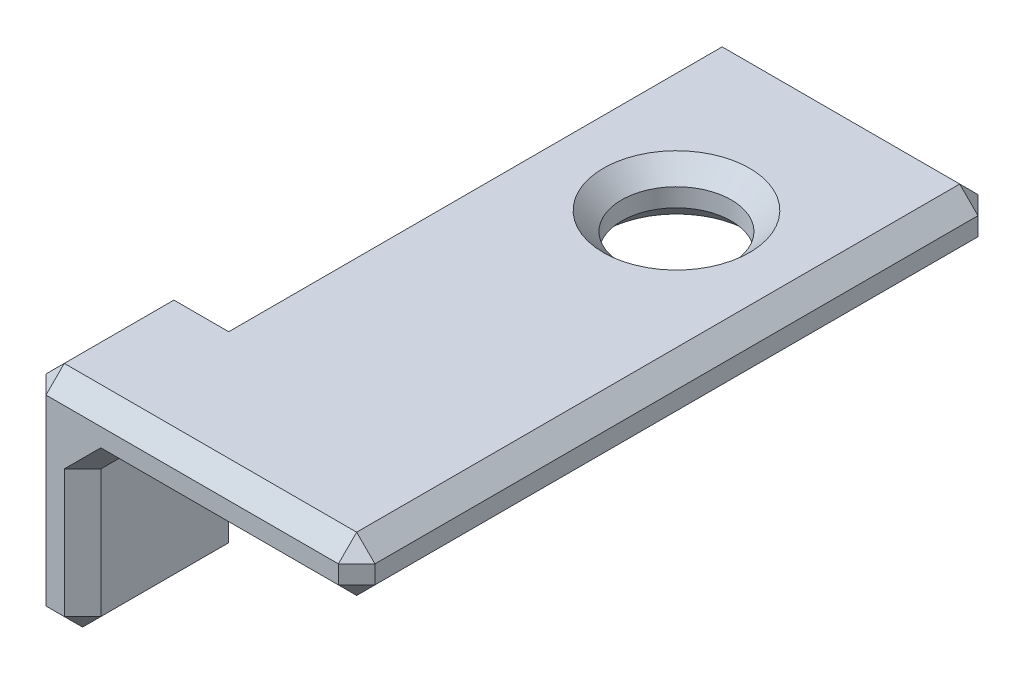
ISO-10303-21;
HEADER;
FILE_DESCRIPTION(('STEP AP214'),'2;1');
FILE_NAME('part.step','',(''),(''),'','','');
FILE_SCHEMA(('AUTOMOTIVE_DESIGN { 1 0 10303 214 1 1 1 1 }'));
ENDSEC;
DATA;
#1=APPLICATION_CONTEXT('core data for automotive mechanical design processes');
#2=APPLICATION_PROTOCOL_DEFINITION('international standard','automotive_design',2000,#1);
#3=PRODUCT_CONTEXT('',#1,'mechanical');
#4=PRODUCT('Part','Part','',(#3));
#5=PRODUCT_RELATED_PRODUCT_CATEGORY('part','',(#4));
#6=PRODUCT_DEFINITION_FORMATION('','',#4);
#7=PRODUCT_DEFINITION_CONTEXT('part definition',#1,'design');
#8=PRODUCT_DEFINITION('design','',#6,#7);
#9=PRODUCT_DEFINITION_SHAPE('','',#8);
#10=(LENGTH_UNIT() NAMED_UNIT(*) SI_UNIT(.MILLI.,.METRE.));
#11=(NAMED_UNIT(*) PLANE_ANGLE_UNIT() SI_UNIT($,.RADIAN.));
#12=(NAMED_UNIT(*) SI_UNIT($,.STERADIAN.) SOLID_ANGLE_UNIT());
#13=UNCERTAINTY_MEASURE_WITH_UNIT(LENGTH_MEASURE(1.E-05),#10,'distance_accuracy_value','');
#14=(GEOMETRIC_REPRESENTATION_CONTEXT(3) GLOBAL_UNCERTAINTY_ASSIGNED_CONTEXT((#13)) GLOBAL_UNIT_ASSIGNED_CONTEXT((#10,
#11,#12)) REPRESENTATION_CONTEXT('',''));
#15=CARTESIAN_POINT('',(0.,0.,0.));
#16=DIRECTION('',(0.,0.,1.));
#17=DIRECTION('',(1.,0.,0.));
#18=AXIS2_PLACEMENT_3D('',#15,#16,#17);
#19=CARTESIAN_POINT('',(0.,3.,0.));
#20=DIRECTION('',(1.,0.,0.));
#21=DIRECTION('',(0.,0.,-1.));
#22=AXIS2_PLACEMENT_3D('',#19,#20,#21);
#23=PLANE('',#22);
#24=DIRECTION('',(0.,0.,-1.));
#25=VECTOR('',#24,1.);
#26=CARTESIAN_POINT('',(0.,1.99999999999999,0.));
#27=LINE('',#26,#25);
#28=CARTESIAN_POINT('',(0.,2.,27.));
#29=VERTEX_POINT('',#28);
#30=CARTESIAN_POINT('',(0.,1.99999999999999,1.));
#31=VERTEX_POINT('',#30);
#32=EDGE_CURVE('E291',#29,#31,#27,.T.);
#33=ORIENTED_EDGE('',*,*,#32,.T.);
#34=DIRECTION('',(0.,-1.,0.));
#35=VECTOR('',#34,1.);
#36=CARTESIAN_POINT('',(0.,3.,1.));
#37=LINE('',#36,#35);
#38=CARTESIAN_POINT('',(0.,0.,1.));
#39=VERTEX_POINT('',#38);
#40=EDGE_CURVE('E213',#31,#39,#37,.T.);
#41=ORIENTED_EDGE('',*,*,#40,.T.);
#42=DIRECTION('',(0.,0.,1.));
#43=VECTOR('',#42,1.);
#44=CARTESIAN_POINT('',(0.,0.,0.));
#45=LINE('',#44,#43);
#46=CARTESIAN_POINT('',(0.,0.,27.));
#47=VERTEX_POINT('',#46);
#48=EDGE_CURVE('E199',#39,#47,#45,.T.);
#49=ORIENTED_EDGE('',*,*,#48,.T.);
#50=DIRECTION('',(0.,-1.,0.));
#51=VECTOR('',#50,1.);
#52=CARTESIAN_POINT('',(0.,3.,27.));
#53=LINE('',#52,#51);
#54=EDGE_CURVE('E189',#29,#47,#53,.T.);
#55=ORIENTED_EDGE('',*,*,#54,.F.);
#56=EDGE_LOOP('',(#33,#41,#49,#55));
#57=FACE_BOUND('',#56,.T.);
#58=ADVANCED_FACE('F43',(#57),#23,.F.);
#59=CARTESIAN_POINT('',(0.,3.,0.));
#60=DIRECTION('',(0.,1.,0.));
#61=DIRECTION('',(0.,0.,1.));
#62=AXIS2_PLACEMENT_3D('',#59,#60,#61);
#63=PLANE('',#62);
#64=CARTESIAN_POINT('',(7.5,3.,10.));
#65=DIRECTION('',(0.,1.,0.));
#66=DIRECTION('',(0.,0.,1.));
#67=AXIS2_PLACEMENT_3D('',#64,#65,#66);
#68=CIRCLE('',#67,4.);
#69=CARTESIAN_POINT('',(7.5,3.,14.));
#70=VERTEX_POINT('',#69);
#71=EDGE_CURVE('E236',#70,#70,#68,.F.);
#72=ORIENTED_EDGE('',*,*,#71,.T.);
#73=EDGE_LOOP('',(#72));
#74=FACE_BOUND('',#73,.T.);
#75=DIRECTION('',(0.,0.,-1.));
#76=VECTOR('',#75,1.);
#77=CARTESIAN_POINT('',(14.,3.,0.));
#78=LINE('',#77,#76);
#79=CARTESIAN_POINT('',(14.,3.,34.));
#80=VERTEX_POINT('',#79);
#81=CARTESIAN_POINT('',(14.,3.,1.));
#82=VERTEX_POINT('',#81);
#83=EDGE_CURVE('E231',#80,#82,#78,.T.);
#84=ORIENTED_EDGE('',*,*,#83,.T.);
#85=DIRECTION('',(-1.,0.,0.));
#86=VECTOR('',#85,1.);
#87=CARTESIAN_POINT('',(0.,3.,1.));
#88=LINE('',#87,#86);
#89=CARTESIAN_POINT('',(1.,3.,1.));
#90=VERTEX_POINT('',#89);
#91=EDGE_CURVE('E233',#82,#90,#88,.T.);
#92=ORIENTED_EDGE('',*,*,#91,.T.);
#93=DIRECTION('',(0.,0.,1.));
#94=VECTOR('',#93,1.);
#95=CARTESIAN_POINT('',(1.,3.,27.));
#96=LINE('',#95,#94);
#97=CARTESIAN_POINT('',(1.,3.,28.));
#98=VERTEX_POINT('',#97);
#99=EDGE_CURVE('E225',#90,#98,#96,.T.);
#100=ORIENTED_EDGE('',*,*,#99,.T.);
#101=DIRECTION('',(-1.,0.,0.));
#102=VECTOR('',#101,1.);
#103=CARTESIAN_POINT('',(0.,3.,28.));
#104=LINE('',#103,#102);
#105=CARTESIAN_POINT('',(-1.99999999999999,3.,28.));
#106=VERTEX_POINT('',#105);
#107=EDGE_CURVE('E223',#98,#106,#104,.T.);
#108=ORIENTED_EDGE('',*,*,#107,.T.);
#109=DIRECTION('',(0.,0.,1.));
#110=VECTOR('',#109,1.);
#111=CARTESIAN_POINT('',(-1.99999999999999,3.,0.));
#112=LINE('',#111,#110);
#113=CARTESIAN_POINT('',(-1.99999999999999,3.,34.));
#114=VERTEX_POINT('',#113);
#115=EDGE_CURVE('E227',#106,#114,#112,.T.);
#116=ORIENTED_EDGE('',*,*,#115,.T.);
#117=DIRECTION('',(1.,0.,0.));
#118=VECTOR('',#117,1.);
#119=CARTESIAN_POINT('',(0.,3.,34.));
#120=LINE('',#119,#118);
#121=EDGE_CURVE('E229',#114,#80,#120,.T.);
#122=ORIENTED_EDGE('',*,*,#121,.T.);
#123=EDGE_LOOP('',(#84,#92,#100,#108,#116,#122));
#124=FACE_BOUND('',#123,.T.);
#125=ADVANCED_FACE('F458',(#74,#124),#63,.T.);
#126=CARTESIAN_POINT('',(0.,0.,0.));
#127=DIRECTION('',(0.,1.,0.));
#128=DIRECTION('',(0.,0.,1.));
#129=AXIS2_PLACEMENT_3D('',#126,#127,#128);
#130=PLANE('',#129);
#131=CARTESIAN_POINT('',(7.5,0.,10.));
#132=DIRECTION('',(0.,1.,0.));
#133=DIRECTION('',(0.,0.,1.));
#134=AXIS2_PLACEMENT_3D('',#131,#132,#133);
#135=CIRCLE('',#134,4.);
#136=CARTESIAN_POINT('',(7.5,0.,14.));
#137=VERTEX_POINT('',#136);
#138=EDGE_CURVE('E210',#137,#137,#135,.T.);
#139=ORIENTED_EDGE('',*,*,#138,.T.);
#140=EDGE_LOOP('',(#139));
#141=FACE_BOUND('',#140,.T.);
#142=DIRECTION('',(0.,0.,-1.));
#143=VECTOR('',#142,1.);
#144=CARTESIAN_POINT('',(1.,0.,0.));
#145=LINE('',#144,#143);
#146=CARTESIAN_POINT('',(1.00000000000001,0.,34.));
#147=VERTEX_POINT('',#146);
#148=CARTESIAN_POINT('',(1.00000000000001,0.,27.));
#149=VERTEX_POINT('',#148);
#150=EDGE_CURVE('E208',#147,#149,#145,.T.);
#151=ORIENTED_EDGE('',*,*,#150,.T.);
#152=DIRECTION('',(-1.,0.,0.));
#153=VECTOR('',#152,1.);
#154=CARTESIAN_POINT('',(0.,0.,27.));
#155=LINE('',#154,#153);
#156=EDGE_CURVE('E192',#149,#47,#155,.T.);
#157=ORIENTED_EDGE('',*,*,#156,.T.);
#158=ORIENTED_EDGE('',*,*,#48,.F.);
#159=DIRECTION('',(1.,0.,0.));
#160=VECTOR('',#159,1.);
#161=CARTESIAN_POINT('',(0.,0.,1.00000000000001));
#162=LINE('',#161,#160);
#163=CARTESIAN_POINT('',(14.,0.,1.00000000000001));
#164=VERTEX_POINT('',#163);
#165=EDGE_CURVE('E239',#39,#164,#162,.T.);
#166=ORIENTED_EDGE('',*,*,#165,.T.);
#167=DIRECTION('',(0.,0.,1.));
#168=VECTOR('',#167,1.);
#169=CARTESIAN_POINT('',(14.,0.,0.));
#170=LINE('',#169,#168);
#171=CARTESIAN_POINT('',(14.,0.,34.));
#172=VERTEX_POINT('',#171);
#173=EDGE_CURVE('E241',#164,#172,#170,.T.);
#174=ORIENTED_EDGE('',*,*,#173,.T.);
#175=DIRECTION('',(-1.,0.,0.));
#176=VECTOR('',#175,1.);
#177=CARTESIAN_POINT('',(0.,0.,34.));
#178=LINE('',#177,#176);
#179=EDGE_CURVE('E243',#172,#147,#178,.T.);
#180=ORIENTED_EDGE('',*,*,#179,.T.);
#181=EDGE_LOOP('',(#151,#157,#158,#166,#174,#180));
#182=FACE_BOUND('',#181,.T.);
#183=ADVANCED_FACE('F204',(#141,#182),#130,.F.);
#184=CARTESIAN_POINT('',(15.,3.,0.));
#185=DIRECTION('',(-1.,0.,0.));
#186=DIRECTION('',(0.,0.,1.));
#187=AXIS2_PLACEMENT_3D('',#184,#185,#186);
#188=PLANE('',#187);
#189=DIRECTION('',(0.,0.,1.));
#190=VECTOR('',#189,1.);
#191=CARTESIAN_POINT('',(15.,1.99999999999999,35.));
#192=LINE('',#191,#190);
#193=CARTESIAN_POINT('',(15.,1.99999999999999,1.00000000000001));
#194=VERTEX_POINT('',#193);
#195=CARTESIAN_POINT('',(15.,1.99999999999999,34.));
#196=VERTEX_POINT('',#195);
#197=EDGE_CURVE('E273',#194,#196,#192,.T.);
#198=ORIENTED_EDGE('',*,*,#197,.T.);
#199=DIRECTION('',(0.,-1.,0.));
#200=VECTOR('',#199,1.);
#201=CARTESIAN_POINT('',(15.,0.,34.));
#202=LINE('',#201,#200);
#203=CARTESIAN_POINT('',(15.,1.,34.));
#204=VERTEX_POINT('',#203);
#205=EDGE_CURVE('E279',#196,#204,#202,.T.);
#206=ORIENTED_EDGE('',*,*,#205,.T.);
#207=DIRECTION('',(0.,0.,-1.));
#208=VECTOR('',#207,1.);
#209=CARTESIAN_POINT('',(15.,1.,0.));
#210=LINE('',#209,#208);
#211=CARTESIAN_POINT('',(15.,1.,1.00000000000001));
#212=VERTEX_POINT('',#211);
#213=EDGE_CURVE('E277',#204,#212,#210,.T.);
#214=ORIENTED_EDGE('',*,*,#213,.T.);
#215=DIRECTION('',(0.,1.,0.));
#216=VECTOR('',#215,1.);
#217=CARTESIAN_POINT('',(15.,3.,1.00000000000001));
#218=LINE('',#217,#216);
#219=EDGE_CURVE('E275',#212,#194,#218,.T.);
#220=ORIENTED_EDGE('',*,*,#219,.T.);
#221=EDGE_LOOP('',(#198,#206,#214,#220));
#222=FACE_BOUND('',#221,.T.);
#223=ADVANCED_FACE('F467',(#222),#188,.F.);
#224=CARTESIAN_POINT('',(0.,3.,0.));
#225=DIRECTION('',(0.,0.,1.));
#226=DIRECTION('',(1.,0.,0.));
#227=AXIS2_PLACEMENT_3D('',#224,#225,#226);
#228=PLANE('',#227);
#229=DIRECTION('',(1.,0.,0.));
#230=VECTOR('',#229,1.);
#231=CARTESIAN_POINT('',(15.,1.99999999999999,0.));
#232=LINE('',#231,#230);
#233=CARTESIAN_POINT('',(1.00000000000001,1.99999999999999,0.));
#234=VERTEX_POINT('',#233);
#235=CARTESIAN_POINT('',(14.,1.99999999999999,0.));
#236=VERTEX_POINT('',#235);
#237=EDGE_CURVE('E282',#234,#236,#232,.T.);
#238=ORIENTED_EDGE('',*,*,#237,.T.);
#239=DIRECTION('',(0.,-1.,0.));
#240=VECTOR('',#239,1.);
#241=CARTESIAN_POINT('',(14.,3.,0.));
#242=LINE('',#241,#240);
#243=CARTESIAN_POINT('',(14.,1.,0.));
#244=VERTEX_POINT('',#243);
#245=EDGE_CURVE('E288',#236,#244,#242,.T.);
#246=ORIENTED_EDGE('',*,*,#245,.T.);
#247=DIRECTION('',(-1.,0.,0.));
#248=VECTOR('',#247,1.);
#249=CARTESIAN_POINT('',(0.,1.,0.));
#250=LINE('',#249,#248);
#251=CARTESIAN_POINT('',(1.00000000000001,1.,0.));
#252=VERTEX_POINT('',#251);
#253=EDGE_CURVE('E286',#244,#252,#250,.T.);
#254=ORIENTED_EDGE('',*,*,#253,.T.);
#255=DIRECTION('',(0.,1.,0.));
#256=VECTOR('',#255,1.);
#257=CARTESIAN_POINT('',(1.00000000000001,3.,0.));
#258=LINE('',#257,#256);
#259=EDGE_CURVE('E284',#252,#234,#258,.T.);
#260=ORIENTED_EDGE('',*,*,#259,.T.);
#261=EDGE_LOOP('',(#238,#246,#254,#260));
#262=FACE_BOUND('',#261,.T.);
#263=ADVANCED_FACE('F889',(#262),#228,.F.);
#264=CARTESIAN_POINT('',(7.5,3.,10.));
#265=DIRECTION('',(0.,-1.,0.));
#266=DIRECTION('',(0.,0.,-1.));
#267=AXIS2_PLACEMENT_3D('',#264,#265,#266);
#268=CYLINDRICAL_SURFACE('',#267,3.);
#269=CARTESIAN_POINT('',(7.5,2.,10.));
#270=DIRECTION('',(0.,1.,0.));
#271=DIRECTION('',(0.,0.,1.));
#272=AXIS2_PLACEMENT_3D('',#269,#270,#271);
#273=CIRCLE('',#272,3.);
#274=CARTESIAN_POINT('',(7.5,2.,13.));
#275=VERTEX_POINT('',#274);
#276=EDGE_CURVE('E217',#275,#275,#273,.T.);
#277=ORIENTED_EDGE('',*,*,#276,.T.);
#278=EDGE_LOOP('',(#277));
#279=FACE_BOUND('',#278,.T.);
#280=CARTESIAN_POINT('',(7.5,1.,10.));
#281=DIRECTION('',(0.,1.,0.));
#282=DIRECTION('',(0.,0.,1.));
#283=AXIS2_PLACEMENT_3D('',#280,#281,#282);
#284=CIRCLE('',#283,3.);
#285=CARTESIAN_POINT('',(7.5,1.,13.));
#286=VERTEX_POINT('',#285);
#287=EDGE_CURVE('E214',#286,#286,#284,.F.);
#288=ORIENTED_EDGE('',*,*,#287,.T.);
#289=EDGE_LOOP('',(#288));
#290=FACE_BOUND('',#289,.T.);
#291=ADVANCED_FACE('F879',(#279,#290),#268,.F.);
#292=CARTESIAN_POINT('',(0.,0.,35.));
#293=DIRECTION('',(0.,0.,1.));
#294=DIRECTION('',(1.,0.,0.));
#295=AXIS2_PLACEMENT_3D('',#292,#293,#294);
#296=PLANE('',#295);
#297=DIRECTION('',(-0.707106781186546,-0.707106781186549,0.));
#298=VECTOR('',#297,1.);
#299=CARTESIAN_POINT('',(0.,0.,35.));
#300=LINE('',#299,#298);
#301=CARTESIAN_POINT('',(1.00000000000001,1.,35.));
#302=VERTEX_POINT('',#301);
#303=CARTESIAN_POINT('',(0.,0.,35.));
#304=VERTEX_POINT('',#303);
#305=EDGE_CURVE('E261',#302,#304,#300,.T.);
#306=ORIENTED_EDGE('',*,*,#305,.F.);
#307=DIRECTION('',(1.,0.,0.));
#308=VECTOR('',#307,1.);
#309=CARTESIAN_POINT('',(15.,1.,35.));
#310=LINE('',#309,#308);
#311=CARTESIAN_POINT('',(14.,1.,35.));
#312=VERTEX_POINT('',#311);
#313=EDGE_CURVE('E264',#302,#312,#310,.T.);
#314=ORIENTED_EDGE('',*,*,#313,.T.);
#315=DIRECTION('',(0.,1.,0.));
#316=VECTOR('',#315,1.);
#317=CARTESIAN_POINT('',(14.,3.,35.));
#318=LINE('',#317,#316);
#319=CARTESIAN_POINT('',(14.,1.99999999999999,35.));
#320=VERTEX_POINT('',#319);
#321=EDGE_CURVE('E256',#312,#320,#318,.T.);
#322=ORIENTED_EDGE('',*,*,#321,.T.);
#323=DIRECTION('',(-1.,0.,0.));
#324=VECTOR('',#323,1.);
#325=CARTESIAN_POINT('',(0.,1.99999999999999,35.));
#326=LINE('',#325,#324);
#327=CARTESIAN_POINT('',(-2.,1.99999999999999,35.));
#328=VERTEX_POINT('',#327);
#329=EDGE_CURVE('E254',#320,#328,#326,.T.);
#330=ORIENTED_EDGE('',*,*,#329,.T.);
#331=DIRECTION('',(0.,-1.,0.));
#332=VECTOR('',#331,1.);
#333=CARTESIAN_POINT('',(-2.,0.,35.));
#334=LINE('',#333,#332);
#335=CARTESIAN_POINT('',(-2.,-7.99999999999999,35.));
#336=VERTEX_POINT('',#335);
#337=EDGE_CURVE('E250',#328,#336,#334,.T.);
#338=ORIENTED_EDGE('',*,*,#337,.T.);
#339=DIRECTION('',(1.,0.,0.));
#340=VECTOR('',#339,1.);
#341=CARTESIAN_POINT('',(0.,-7.99999999999999,35.));
#342=LINE('',#341,#340);
#343=CARTESIAN_POINT('',(-1.,-7.99999999999999,35.));
#344=VERTEX_POINT('',#343);
#345=EDGE_CURVE('E248',#336,#344,#342,.T.);
#346=ORIENTED_EDGE('',*,*,#345,.T.);
#347=DIRECTION('',(0.,1.,0.));
#348=VECTOR('',#347,1.);
#349=CARTESIAN_POINT('',(-1.,0.,35.));
#350=LINE('',#349,#348);
#351=CARTESIAN_POINT('',(-1.,-1.00000000000001,35.));
#352=VERTEX_POINT('',#351);
#353=EDGE_CURVE('E252',#344,#352,#350,.T.);
#354=ORIENTED_EDGE('',*,*,#353,.T.);
#355=DIRECTION('',(-0.707106781186546,-0.707106781186549,0.));
#356=VECTOR('',#355,1.);
#357=CARTESIAN_POINT('',(0.,0.,35.));
#358=LINE('',#357,#356);
#359=EDGE_CURVE('E258',#304,#352,#358,.T.);
#360=ORIENTED_EDGE('',*,*,#359,.F.);
#361=EDGE_LOOP('',(#306,#314,#322,#330,#338,#346,#354,#360));
#362=FACE_BOUND('',#361,.T.);
#363=ADVANCED_FACE('F863',(#362),#296,.T.);
#364=CARTESIAN_POINT('',(0.,3.,35.));
#365=DIRECTION('',(1.,0.,0.));
#366=DIRECTION('',(0.,0.,-1.));
#367=AXIS2_PLACEMENT_3D('',#364,#365,#366);
#368=PLANE('',#367);
#369=CARTESIAN_POINT('',(0.,-1.00000000000001,27.));
#370=VERTEX_POINT('',#369);
#371=CARTESIAN_POINT('',(0.,-7.99999999999999,27.));
#372=VERTEX_POINT('',#371);
#373=EDGE_CURVE('E200',#370,#372,#53,.T.);
#374=ORIENTED_EDGE('',*,*,#373,.F.);
#375=DIRECTION('',(0.,0.,1.));
#376=VECTOR('',#375,1.);
#377=CARTESIAN_POINT('',(0.,-1.00000000000001,35.));
#378=LINE('',#377,#376);
#379=CARTESIAN_POINT('',(0.,-1.00000000000001,34.));
#380=VERTEX_POINT('',#379);
#381=EDGE_CURVE('E271',#370,#380,#378,.T.);
#382=ORIENTED_EDGE('',*,*,#381,.T.);
#383=DIRECTION('',(0.,-1.,0.));
#384=VECTOR('',#383,1.);
#385=CARTESIAN_POINT('',(0.,3.,34.));
#386=LINE('',#385,#384);
#387=CARTESIAN_POINT('',(0.,-7.99999999999999,34.));
#388=VERTEX_POINT('',#387);
#389=EDGE_CURVE('E269',#380,#388,#386,.T.);
#390=ORIENTED_EDGE('',*,*,#389,.T.);
#391=DIRECTION('',(0.,0.,-1.));
#392=VECTOR('',#391,1.);
#393=CARTESIAN_POINT('',(0.,-7.99999999999999,27.));
#394=LINE('',#393,#392);
#395=EDGE_CURVE('E267',#388,#372,#394,.T.);
#396=ORIENTED_EDGE('',*,*,#395,.T.);
#397=EDGE_LOOP('',(#374,#382,#390,#396));
#398=FACE_BOUND('',#397,.T.);
#399=ADVANCED_FACE('F856',(#398),#368,.T.);
#400=CARTESIAN_POINT('',(0.,3.,27.));
#401=DIRECTION('',(0.,0.,-1.));
#402=DIRECTION('',(-1.,0.,0.));
#403=AXIS2_PLACEMENT_3D('',#400,#401,#402);
#404=PLANE('',#403);
#405=DIRECTION('',(0.,1.,0.));
#406=VECTOR('',#405,1.);
#407=CARTESIAN_POINT('',(-1.99999999999999,3.,27.));
#408=LINE('',#407,#406);
#409=CARTESIAN_POINT('',(-1.99999999999999,-9.,27.));
#410=VERTEX_POINT('',#409);
#411=CARTESIAN_POINT('',(-1.99999999999999,2.,27.));
#412=VERTEX_POINT('',#411);
#413=EDGE_CURVE('E305',#410,#412,#408,.T.);
#414=ORIENTED_EDGE('',*,*,#413,.T.);
#415=DIRECTION('',(1.,0.,0.));
#416=VECTOR('',#415,1.);
#417=CARTESIAN_POINT('',(0.,2.,27.));
#418=LINE('',#417,#416);
#419=EDGE_CURVE('E195',#412,#29,#418,.T.);
#420=ORIENTED_EDGE('',*,*,#419,.T.);
#421=ORIENTED_EDGE('',*,*,#54,.T.);
#422=ORIENTED_EDGE('',*,*,#156,.F.);
#423=DIRECTION('',(-0.707106781186546,-0.707106781186549,0.));
#424=VECTOR('',#423,1.);
#425=CARTESIAN_POINT('',(0.,-1.00000000000001,27.));
#426=LINE('',#425,#424);
#427=EDGE_CURVE('E11',#149,#370,#426,.T.);
#428=ORIENTED_EDGE('',*,*,#427,.T.);
#429=ORIENTED_EDGE('',*,*,#373,.T.);
#430=DIRECTION('',(-0.707106781186546,-0.707106781186549,0.));
#431=VECTOR('',#430,1.);
#432=CARTESIAN_POINT('',(5.5,-2.49999999999998,27.));
#433=LINE('',#432,#431);
#434=CARTESIAN_POINT('',(-1.,-9.,27.));
#435=VERTEX_POINT('',#434);
#436=EDGE_CURVE('E303',#372,#435,#433,.T.);
#437=ORIENTED_EDGE('',*,*,#436,.T.);
#438=DIRECTION('',(1.,0.,0.));
#439=VECTOR('',#438,1.);
#440=CARTESIAN_POINT('',(0.,-9.,27.));
#441=LINE('',#440,#439);
#442=EDGE_CURVE('E403',#410,#435,#441,.T.);
#443=ORIENTED_EDGE('',*,*,#442,.F.);
#444=EDGE_LOOP('',(#414,#420,#421,#422,#428,#429,#437,#443));
#445=FACE_BOUND('',#444,.T.);
#446=ADVANCED_FACE('F191',(#445),#404,.T.);
#447=CARTESIAN_POINT('',(-3.,3.,35.));
#448=DIRECTION('',(-1.,0.,0.));
#449=DIRECTION('',(0.,0.,1.));
#450=AXIS2_PLACEMENT_3D('',#447,#448,#449);
#451=PLANE('',#450);
#452=DIRECTION('',(0.,0.,1.));
#453=VECTOR('',#452,1.);
#454=CARTESIAN_POINT('',(-3.,-7.99999999999999,35.));
#455=LINE('',#454,#453);
#456=CARTESIAN_POINT('',(-3.,-7.99999999999999,28.));
#457=VERTEX_POINT('',#456);
#458=CARTESIAN_POINT('',(-3.,-7.99999999999999,34.));
#459=VERTEX_POINT('',#458);
#460=EDGE_CURVE('E294',#457,#459,#455,.T.);
#461=ORIENTED_EDGE('',*,*,#460,.T.);
#462=DIRECTION('',(0.,1.,0.));
#463=VECTOR('',#462,1.);
#464=CARTESIAN_POINT('',(-3.,3.,34.));
#465=LINE('',#464,#463);
#466=CARTESIAN_POINT('',(-3.,2.,34.));
#467=VERTEX_POINT('',#466);
#468=EDGE_CURVE('E300',#459,#467,#465,.T.);
#469=ORIENTED_EDGE('',*,*,#468,.T.);
#470=DIRECTION('',(0.,0.,-1.));
#471=VECTOR('',#470,1.);
#472=CARTESIAN_POINT('',(-3.,2.,35.));
#473=LINE('',#472,#471);
#474=CARTESIAN_POINT('',(-3.,2.,28.));
#475=VERTEX_POINT('',#474);
#476=EDGE_CURVE('E298',#467,#475,#473,.T.);
#477=ORIENTED_EDGE('',*,*,#476,.T.);
#478=DIRECTION('',(0.,-1.,0.));
#479=VECTOR('',#478,1.);
#480=CARTESIAN_POINT('',(-3.,3.,28.));
#481=LINE('',#480,#479);
#482=EDGE_CURVE('E296',#475,#457,#481,.T.);
#483=ORIENTED_EDGE('',*,*,#482,.T.);
#484=EDGE_LOOP('',(#461,#469,#477,#483));
#485=FACE_BOUND('',#484,.T.);
#486=ADVANCED_FACE('F438',(#485),#451,.T.);
#487=CARTESIAN_POINT('',(0.,-9.,0.));
#488=DIRECTION('',(0.,1.,0.));
#489=DIRECTION('',(0.,0.,1.));
#490=AXIS2_PLACEMENT_3D('',#487,#488,#489);
#491=PLANE('',#490);
#492=DIRECTION('',(-1.,0.,0.));
#493=VECTOR('',#492,1.);
#494=CARTESIAN_POINT('',(-3.,-9.,34.));
#495=LINE('',#494,#493);
#496=CARTESIAN_POINT('',(-1.,-9.,34.));
#497=VERTEX_POINT('',#496);
#498=CARTESIAN_POINT('',(-2.,-9.,34.));
#499=VERTEX_POINT('',#498);
#500=EDGE_CURVE('E61',#497,#499,#495,.T.);
#501=ORIENTED_EDGE('',*,*,#500,.T.);
#502=DIRECTION('',(0.,0.,-1.));
#503=VECTOR('',#502,1.);
#504=CARTESIAN_POINT('',(-1.99999999999999,-9.,27.));
#505=LINE('',#504,#503);
#506=EDGE_CURVE('E53',#499,#410,#505,.T.);
#507=ORIENTED_EDGE('',*,*,#506,.T.);
#508=ORIENTED_EDGE('',*,*,#442,.T.);
#509=DIRECTION('',(0.,0.,1.));
#510=VECTOR('',#509,1.);
#511=CARTESIAN_POINT('',(-1.,-9.,35.));
#512=LINE('',#511,#510);
#513=EDGE_CURVE('E66',#435,#497,#512,.T.);
#514=ORIENTED_EDGE('',*,*,#513,.T.);
#515=EDGE_LOOP('',(#501,#507,#508,#514));
#516=FACE_BOUND('',#515,.T.);
#517=ADVANCED_FACE('F432',(#516),#491,.F.);
#518=CARTESIAN_POINT('',(7.5,2.,10.));
#519=DIRECTION('',(0.,1.,0.));
#520=DIRECTION('',(0.,0.,1.));
#521=AXIS2_PLACEMENT_3D('',#518,#519,#520);
#522=CONICAL_SURFACE('',#521,3.,0.785398163397448);
#523=ORIENTED_EDGE('',*,*,#71,.F.);
#524=EDGE_LOOP('',(#523));
#525=FACE_BOUND('',#524,.T.);
#526=ORIENTED_EDGE('',*,*,#276,.F.);
#527=EDGE_LOOP('',(#526));
#528=FACE_BOUND('',#527,.T.);
#529=ADVANCED_FACE('F470',(#525,#528),#522,.F.);
#530=CARTESIAN_POINT('',(7.5,0.,10.));
#531=DIRECTION('',(0.,-1.,0.));
#532=DIRECTION('',(0.,0.,-1.));
#533=AXIS2_PLACEMENT_3D('',#530,#531,#532);
#534=CONICAL_SURFACE('',#533,4.,0.785398163397447);
#535=ORIENTED_EDGE('',*,*,#287,.F.);
#536=EDGE_LOOP('',(#535));
#537=FACE_BOUND('',#536,.T.);
#538=ORIENTED_EDGE('',*,*,#138,.F.);
#539=EDGE_LOOP('',(#538));
#540=FACE_BOUND('',#539,.T.);
#541=ADVANCED_FACE('F476',(#537,#540),#534,.F.);
#542=CARTESIAN_POINT('',(0.,2.,27.));
#543=DIRECTION('',(0.,-0.707106781186549,0.707106781186546));
#544=DIRECTION('',(1.,0.,0.));
#545=AXIS2_PLACEMENT_3D('',#542,#543,#544);
#546=PLANE('',#545);
#547=DIRECTION('',(0.577350269189624,0.577350269189626,0.577350269189628));
#548=VECTOR('',#547,1.);
#549=CARTESIAN_POINT('',(-8.33333333333333,-6.33333333333337,18.6666666666666));
#550=LINE('',#549,#548);
#551=EDGE_CURVE('E395',#29,#98,#550,.T.);
#552=ORIENTED_EDGE('',*,*,#551,.F.);
#553=ORIENTED_EDGE('',*,*,#419,.F.);
#554=DIRECTION('',(0.,0.707106781186546,0.707106781186549));
#555=VECTOR('',#554,1.);
#556=CARTESIAN_POINT('',(-1.99999999999999,2.5,27.5));
#557=LINE('',#556,#555);
#558=EDGE_CURVE('E397',#106,#412,#557,.F.);
#559=ORIENTED_EDGE('',*,*,#558,.F.);
#560=ORIENTED_EDGE('',*,*,#107,.F.);
#561=EDGE_LOOP('',(#552,#553,#559,#560));
#562=FACE_BOUND('',#561,.T.);
#563=ADVANCED_FACE('F46',(#562),#546,.F.);
#564=CARTESIAN_POINT('',(-3.,3.,28.));
#565=DIRECTION('',(0.707106781186546,0.,0.707106781186549));
#566=DIRECTION('',(0.,-1.,0.));
#567=AXIS2_PLACEMENT_3D('',#564,#565,#566);
#568=PLANE('',#567);
#569=DIRECTION('',(0.707106781186549,0.,-0.707106781186546));
#570=VECTOR('',#569,1.);
#571=CARTESIAN_POINT('',(-3.,2.,28.));
#572=LINE('',#571,#570);
#573=EDGE_CURVE('E48',#412,#475,#572,.F.);
#574=ORIENTED_EDGE('',*,*,#573,.F.);
#575=ORIENTED_EDGE('',*,*,#413,.F.);
#576=DIRECTION('',(-0.577350269189626,0.577350269189628,0.577350269189624));
#577=VECTOR('',#576,1.);
#578=CARTESIAN_POINT('',(6.99999999999998,-18.,18.0000000000001));
#579=LINE('',#578,#577);
#580=EDGE_CURVE('E392',#457,#410,#579,.F.);
#581=ORIENTED_EDGE('',*,*,#580,.F.);
#582=ORIENTED_EDGE('',*,*,#482,.F.);
#583=EDGE_LOOP('',(#574,#575,#581,#582));
#584=FACE_BOUND('',#583,.T.);
#585=ADVANCED_FACE('F435',(#584),#568,.F.);
#586=CARTESIAN_POINT('',(-3.,2.,28.));
#587=DIRECTION('',(-0.577350269189624,0.577350269189628,-0.577350269189626));
#588=DIRECTION('',(0.,0.707106781186546,0.707106781186549));
#589=AXIS2_PLACEMENT_3D('',#586,#587,#588);
#590=PLANE('',#589);
#591=ORIENTED_EDGE('',*,*,#558,.T.);
#592=ORIENTED_EDGE('',*,*,#573,.T.);
#593=DIRECTION('',(-0.707106781186549,-0.707106781186546,0.));
#594=VECTOR('',#593,1.);
#595=CARTESIAN_POINT('',(-3.,2.,28.));
#596=LINE('',#595,#594);
#597=EDGE_CURVE('E389',#106,#475,#596,.T.);
#598=ORIENTED_EDGE('',*,*,#597,.F.);
#599=EDGE_LOOP('',(#591,#592,#598));
#600=FACE_BOUND('',#599,.T.);
#601=ADVANCED_FACE('F446',(#600),#590,.T.);
#602=CARTESIAN_POINT('',(1.,3.,0.));
#603=DIRECTION('',(-0.707106781186549,0.707106781186546,0.));
#604=DIRECTION('',(0.,0.,-1.));
#605=AXIS2_PLACEMENT_3D('',#602,#603,#604);
#606=PLANE('',#605);
#607=ORIENTED_EDGE('',*,*,#551,.T.);
#608=ORIENTED_EDGE('',*,*,#99,.F.);
#609=DIRECTION('',(0.707106781186546,0.707106781186549,0.));
#610=VECTOR('',#609,1.);
#611=CARTESIAN_POINT('',(0.500000000000002,2.5,1.));
#612=LINE('',#611,#610);
#613=EDGE_CURVE('E384',#31,#90,#612,.T.);
#614=ORIENTED_EDGE('',*,*,#613,.F.);
#615=ORIENTED_EDGE('',*,*,#32,.F.);
#616=EDGE_LOOP('',(#607,#608,#614,#615));
#617=FACE_BOUND('',#616,.T.);
#618=ADVANCED_FACE('F448',(#617),#606,.T.);
#619=CARTESIAN_POINT('',(-1.99999999999999,-9.,0.));
#620=DIRECTION('',(-0.707106781186549,-0.707106781186546,0.));
#621=DIRECTION('',(0.,0.,1.));
#622=AXIS2_PLACEMENT_3D('',#619,#620,#621);
#623=PLANE('',#622);
#624=ORIENTED_EDGE('',*,*,#580,.T.);
#625=ORIENTED_EDGE('',*,*,#506,.F.);
#626=DIRECTION('',(0.707106781186546,-0.707106781186549,0.));
#627=VECTOR('',#626,1.);
#628=CARTESIAN_POINT('',(-2.5,-8.5,34.));
#629=LINE('',#628,#627);
#630=EDGE_CURVE('E381',#459,#499,#629,.T.);
#631=ORIENTED_EDGE('',*,*,#630,.F.);
#632=ORIENTED_EDGE('',*,*,#460,.F.);
#633=EDGE_LOOP('',(#624,#625,#631,#632));
#634=FACE_BOUND('',#633,.T.);
#635=ADVANCED_FACE('F430',(#634),#623,.T.);
#636=CARTESIAN_POINT('',(-2.,0.,35.));
#637=DIRECTION('',(0.707106781186549,0.,-0.707106781186546));
#638=DIRECTION('',(0.,-1.,0.));
#639=AXIS2_PLACEMENT_3D('',#636,#637,#638);
#640=PLANE('',#639);
#641=DIRECTION('',(-0.707106781186546,0.,-0.707106781186549));
#642=VECTOR('',#641,1.);
#643=CARTESIAN_POINT('',(-3.,2.,34.));
#644=LINE('',#643,#642);
#645=EDGE_CURVE('E375',#467,#328,#644,.F.);
#646=ORIENTED_EDGE('',*,*,#645,.F.);
#647=ORIENTED_EDGE('',*,*,#468,.F.);
#648=DIRECTION('',(0.707106781186546,0.,0.707106781186549));
#649=VECTOR('',#648,1.);
#650=CARTESIAN_POINT('',(-2.,-7.99999999999999,35.));
#651=LINE('',#650,#649);
#652=EDGE_CURVE('E378',#336,#459,#651,.F.);
#653=ORIENTED_EDGE('',*,*,#652,.F.);
#654=ORIENTED_EDGE('',*,*,#337,.F.);
#655=EDGE_LOOP('',(#646,#647,#653,#654));
#656=FACE_BOUND('',#655,.T.);
#657=ADVANCED_FACE('F635',(#656),#640,.F.);
#658=CARTESIAN_POINT('',(-3.,2.,35.));
#659=DIRECTION('',(0.707106781186546,-0.707106781186549,0.));
#660=DIRECTION('',(0.,0.,-1.));
#661=AXIS2_PLACEMENT_3D('',#658,#659,#660);
#662=PLANE('',#661);
#663=ORIENTED_EDGE('',*,*,#597,.T.);
#664=ORIENTED_EDGE('',*,*,#476,.F.);
#665=DIRECTION('',(0.707106781186549,0.707106781186546,0.));
#666=VECTOR('',#665,1.);
#667=CARTESIAN_POINT('',(-3.,2.,34.));
#668=LINE('',#667,#666);
#669=EDGE_CURVE('E373',#114,#467,#668,.F.);
#670=ORIENTED_EDGE('',*,*,#669,.F.);
#671=ORIENTED_EDGE('',*,*,#115,.F.);
#672=EDGE_LOOP('',(#663,#664,#670,#671));
#673=FACE_BOUND('',#672,.T.);
#674=ADVANCED_FACE('F443',(#673),#662,.F.);
#675=CARTESIAN_POINT('',(0.,3.,1.));
#676=DIRECTION('',(0.,0.707106781186546,-0.707106781186549));
#677=DIRECTION('',(1.,0.,0.));
#678=AXIS2_PLACEMENT_3D('',#675,#676,#677);
#679=PLANE('',#678);
#680=DIRECTION('',(0.,-0.707106781186549,-0.707106781186546));
#681=VECTOR('',#680,1.);
#682=CARTESIAN_POINT('',(1.00000000000001,1.99999999999999,0.));
#683=LINE('',#682,#681);
#684=EDGE_CURVE('E386',#90,#234,#683,.T.);
#685=ORIENTED_EDGE('',*,*,#684,.F.);
#686=ORIENTED_EDGE('',*,*,#91,.F.);
#687=DIRECTION('',(0.,0.707106781186549,0.707106781186546));
#688=VECTOR('',#687,1.);
#689=CARTESIAN_POINT('',(14.,2.5,0.500000000000002));
#690=LINE('',#689,#688);
#691=EDGE_CURVE('E370',#236,#82,#690,.T.);
#692=ORIENTED_EDGE('',*,*,#691,.F.);
#693=ORIENTED_EDGE('',*,*,#237,.F.);
#694=EDGE_LOOP('',(#685,#686,#692,#693));
#695=FACE_BOUND('',#694,.T.);
#696=ADVANCED_FACE('F622',(#695),#679,.T.);
#697=CARTESIAN_POINT('',(1.00000000000001,1.99999999999999,0.));
#698=DIRECTION('',(-0.577350269189626,0.577350269189624,-0.577350269189628));
#699=DIRECTION('',(-0.707106781186549,0.,0.707106781186546));
#700=AXIS2_PLACEMENT_3D('',#697,#698,#699);
#701=PLANE('',#700);
#702=ORIENTED_EDGE('',*,*,#613,.T.);
#703=ORIENTED_EDGE('',*,*,#684,.T.);
#704=DIRECTION('',(0.707106781186549,0.,-0.707106781186546));
#705=VECTOR('',#704,1.);
#706=CARTESIAN_POINT('',(1.00000000000001,1.99999999999999,0.));
#707=LINE('',#706,#705);
#708=EDGE_CURVE('E367',#31,#234,#707,.T.);
#709=ORIENTED_EDGE('',*,*,#708,.F.);
#710=EDGE_LOOP('',(#702,#703,#709));
#711=FACE_BOUND('',#710,.T.);
#712=ADVANCED_FACE('F616',(#711),#701,.T.);
#713=CARTESIAN_POINT('',(-2.,-7.99999999999999,35.));
#714=DIRECTION('',(-0.577350269189628,-0.577350269189622,0.577350269189627));
#715=DIRECTION('',(0.707106781186546,0.,0.707106781186549));
#716=AXIS2_PLACEMENT_3D('',#713,#714,#715);
#717=PLANE('',#716);
#718=ORIENTED_EDGE('',*,*,#652,.T.);
#719=ORIENTED_EDGE('',*,*,#630,.T.);
#720=DIRECTION('',(0.,0.70710678118655,0.707106781186545));
#721=VECTOR('',#720,1.);
#722=CARTESIAN_POINT('',(-2.,-7.99999999999999,35.));
#723=LINE('',#722,#721);
#724=EDGE_CURVE('E364',#336,#499,#723,.F.);
#725=ORIENTED_EDGE('',*,*,#724,.F.);
#726=EDGE_LOOP('',(#718,#719,#725));
#727=FACE_BOUND('',#726,.T.);
#728=ADVANCED_FACE('F425',(#727),#717,.T.);
#729=CARTESIAN_POINT('',(-3.,2.,34.));
#730=DIRECTION('',(-0.577350269189627,0.577350269189624,0.577350269189626));
#731=DIRECTION('',(0.707106781186547,0.,0.707106781186548));
#732=AXIS2_PLACEMENT_3D('',#729,#730,#731);
#733=PLANE('',#732);
#734=ORIENTED_EDGE('',*,*,#669,.T.);
#735=ORIENTED_EDGE('',*,*,#645,.T.);
#736=DIRECTION('',(0.,-0.70710678118655,0.707106781186545));
#737=VECTOR('',#736,1.);
#738=CARTESIAN_POINT('',(-1.99999999999999,2.5,34.5));
#739=LINE('',#738,#737);
#740=EDGE_CURVE('E361',#114,#328,#739,.T.);
#741=ORIENTED_EDGE('',*,*,#740,.F.);
#742=EDGE_LOOP('',(#734,#735,#741));
#743=FACE_BOUND('',#742,.T.);
#744=ADVANCED_FACE('F603',(#743),#733,.T.);
#745=CARTESIAN_POINT('',(15.,1.99999999999999,1.00000000000001));
#746=DIRECTION('',(0.577350269189628,0.577350269189624,-0.577350269189626));
#747=DIRECTION('',(-0.707106781186546,0.,-0.707106781186549));
#748=AXIS2_PLACEMENT_3D('',#745,#746,#747);
#749=PLANE('',#748);
#750=DIRECTION('',(0.707106781186546,0.,0.707106781186549));
#751=VECTOR('',#750,1.);
#752=CARTESIAN_POINT('',(15.,1.99999999999999,1.00000000000001));
#753=LINE('',#752,#751);
#754=EDGE_CURVE('E355',#236,#194,#753,.T.);
#755=ORIENTED_EDGE('',*,*,#754,.F.);
#756=ORIENTED_EDGE('',*,*,#691,.T.);
#757=DIRECTION('',(0.707106781186546,-0.707106781186549,0.));
#758=VECTOR('',#757,1.);
#759=CARTESIAN_POINT('',(15.,1.99999999999999,1.00000000000001));
#760=LINE('',#759,#758);
#761=EDGE_CURVE('E358',#194,#82,#760,.F.);
#762=ORIENTED_EDGE('',*,*,#761,.F.);
#763=EDGE_LOOP('',(#755,#756,#762));
#764=FACE_BOUND('',#763,.T.);
#765=ADVANCED_FACE('F596',(#764),#749,.T.);
#766=CARTESIAN_POINT('',(0.,3.,1.));
#767=DIRECTION('',(0.707106781186546,0.,0.707106781186549));
#768=DIRECTION('',(0.,-1.,0.));
#769=AXIS2_PLACEMENT_3D('',#766,#767,#768);
#770=PLANE('',#769);
#771=ORIENTED_EDGE('',*,*,#708,.T.);
#772=ORIENTED_EDGE('',*,*,#259,.F.);
#773=DIRECTION('',(-0.577350269189628,-0.577350269189624,0.577350269189626));
#774=VECTOR('',#773,1.);
#775=CARTESIAN_POINT('',(0.999999999999999,0.999999999999995,0.));
#776=LINE('',#775,#774);
#777=EDGE_CURVE('E352',#39,#252,#776,.F.);
#778=ORIENTED_EDGE('',*,*,#777,.F.);
#779=ORIENTED_EDGE('',*,*,#40,.F.);
#780=EDGE_LOOP('',(#771,#772,#778,#779));
#781=FACE_BOUND('',#780,.T.);
#782=ADVANCED_FACE('F590',(#781),#770,.F.);
#783=CARTESIAN_POINT('',(-1.00000000000001,-9.,0.));
#784=DIRECTION('',(0.707106781186549,-0.707106781186546,0.));
#785=DIRECTION('',(0.,0.,-1.));
#786=AXIS2_PLACEMENT_3D('',#783,#784,#785);
#787=PLANE('',#786);
#788=ORIENTED_EDGE('',*,*,#436,.F.);
#789=ORIENTED_EDGE('',*,*,#395,.F.);
#790=DIRECTION('',(0.707106781186546,0.707106781186549,0.));
#791=VECTOR('',#790,1.);
#792=CARTESIAN_POINT('',(0.,-7.99999999999999,34.));
#793=LINE('',#792,#791);
#794=EDGE_CURVE('E349',#497,#388,#793,.T.);
#795=ORIENTED_EDGE('',*,*,#794,.F.);
#796=ORIENTED_EDGE('',*,*,#513,.F.);
#797=EDGE_LOOP('',(#788,#789,#795,#796));
#798=FACE_BOUND('',#797,.T.);
#799=ADVANCED_FACE('F413',(#798),#787,.T.);
#800=CARTESIAN_POINT('',(0.,-9.,34.));
#801=DIRECTION('',(0.,-0.707106781186545,0.70710678118655));
#802=DIRECTION('',(1.,0.,0.));
#803=AXIS2_PLACEMENT_3D('',#800,#801,#802);
#804=PLANE('',#803);
#805=ORIENTED_EDGE('',*,*,#724,.T.);
#806=ORIENTED_EDGE('',*,*,#500,.F.);
#807=DIRECTION('',(0.,-0.70710678118655,-0.707106781186545));
#808=VECTOR('',#807,1.);
#809=CARTESIAN_POINT('',(-1.,-8.5,34.5));
#810=LINE('',#809,#808);
#811=EDGE_CURVE('E346',#344,#497,#810,.T.);
#812=ORIENTED_EDGE('',*,*,#811,.F.);
#813=ORIENTED_EDGE('',*,*,#345,.F.);
#814=EDGE_LOOP('',(#805,#806,#812,#813));
#815=FACE_BOUND('',#814,.T.);
#816=ADVANCED_FACE('F422',(#815),#804,.T.);
#817=CARTESIAN_POINT('',(0.,3.,34.));
#818=DIRECTION('',(0.,-0.707106781186545,-0.70710678118655));
#819=DIRECTION('',(1.,0.,0.));
#820=AXIS2_PLACEMENT_3D('',#817,#818,#819);
#821=PLANE('',#820);
#822=ORIENTED_EDGE('',*,*,#740,.T.);
#823=ORIENTED_EDGE('',*,*,#329,.F.);
#824=DIRECTION('',(0.,0.70710678118655,-0.707106781186545));
#825=VECTOR('',#824,1.);
#826=CARTESIAN_POINT('',(14.,1.99999999999999,35.));
#827=LINE('',#826,#825);
#828=EDGE_CURVE('E343',#80,#320,#827,.F.);
#829=ORIENTED_EDGE('',*,*,#828,.F.);
#830=ORIENTED_EDGE('',*,*,#121,.F.);
#831=EDGE_LOOP('',(#822,#823,#829,#830));
#832=FACE_BOUND('',#831,.T.);
#833=ADVANCED_FACE('F572',(#832),#821,.F.);
#834=CARTESIAN_POINT('',(14.,3.,0.));
#835=DIRECTION('',(0.707106781186549,0.707106781186546,0.));
#836=DIRECTION('',(0.,0.,1.));
#837=AXIS2_PLACEMENT_3D('',#834,#835,#836);
#838=PLANE('',#837);
#839=ORIENTED_EDGE('',*,*,#761,.T.);
#840=ORIENTED_EDGE('',*,*,#83,.F.);
#841=DIRECTION('',(-0.707106781186546,0.707106781186549,0.));
#842=VECTOR('',#841,1.);
#843=CARTESIAN_POINT('',(14.5,2.5,34.));
#844=LINE('',#843,#842);
#845=EDGE_CURVE('E340',#196,#80,#844,.T.);
#846=ORIENTED_EDGE('',*,*,#845,.F.);
#847=ORIENTED_EDGE('',*,*,#197,.F.);
#848=EDGE_LOOP('',(#839,#840,#846,#847));
#849=FACE_BOUND('',#848,.T.);
#850=ADVANCED_FACE('F565',(#849),#838,.T.);
#851=CARTESIAN_POINT('',(14.,3.,0.));
#852=DIRECTION('',(-0.707106781186549,0.,0.707106781186547));
#853=DIRECTION('',(0.,-1.,0.));
#854=AXIS2_PLACEMENT_3D('',#851,#852,#853);
#855=PLANE('',#854);
#856=ORIENTED_EDGE('',*,*,#754,.T.);
#857=ORIENTED_EDGE('',*,*,#219,.F.);
#858=DIRECTION('',(-0.707106781186546,0.,-0.707106781186548));
#859=VECTOR('',#858,1.);
#860=CARTESIAN_POINT('',(15.,1.,1.00000000000001));
#861=LINE('',#860,#859);
#862=EDGE_CURVE('E337',#244,#212,#861,.F.);
#863=ORIENTED_EDGE('',*,*,#862,.F.);
#864=ORIENTED_EDGE('',*,*,#245,.F.);
#865=EDGE_LOOP('',(#856,#857,#863,#864));
#866=FACE_BOUND('',#865,.T.);
#867=ADVANCED_FACE('F558',(#866),#855,.F.);
#868=CARTESIAN_POINT('',(0.,1.,0.));
#869=DIRECTION('',(0.,0.707106781186549,0.707106781186546));
#870=DIRECTION('',(-1.,0.,0.));
#871=AXIS2_PLACEMENT_3D('',#868,#869,#870);
#872=PLANE('',#871);
#873=ORIENTED_EDGE('',*,*,#777,.T.);
#874=ORIENTED_EDGE('',*,*,#253,.F.);
#875=DIRECTION('',(0.,-0.707106781186546,0.707106781186549));
#876=VECTOR('',#875,1.);
#877=CARTESIAN_POINT('',(14.,0.500000000000002,0.500000000000004));
#878=LINE('',#877,#876);
#879=EDGE_CURVE('E335',#164,#244,#878,.F.);
#880=ORIENTED_EDGE('',*,*,#879,.F.);
#881=ORIENTED_EDGE('',*,*,#165,.F.);
#882=EDGE_LOOP('',(#873,#874,#880,#881));
#883=FACE_BOUND('',#882,.T.);
#884=ADVANCED_FACE('F552',(#883),#872,.F.);
#885=CARTESIAN_POINT('',(0.,-7.99999999999999,34.));
#886=DIRECTION('',(0.577350269189628,-0.577350269189622,0.577350269189627));
#887=DIRECTION('',(0.707106781186546,0.,-0.707106781186549));
#888=AXIS2_PLACEMENT_3D('',#885,#886,#887);
#889=PLANE('',#888);
#890=ORIENTED_EDGE('',*,*,#811,.T.);
#891=ORIENTED_EDGE('',*,*,#794,.T.);
#892=DIRECTION('',(0.707106781186546,0.,-0.707106781186549));
#893=VECTOR('',#892,1.);
#894=CARTESIAN_POINT('',(0.,-7.99999999999999,34.));
#895=LINE('',#894,#893);
#896=EDGE_CURVE('E332',#344,#388,#895,.T.);
#897=ORIENTED_EDGE('',*,*,#896,.F.);
#898=EDGE_LOOP('',(#890,#891,#897));
#899=FACE_BOUND('',#898,.T.);
#900=ADVANCED_FACE('F418',(#899),#889,.T.);
#901=CARTESIAN_POINT('',(14.,1.99999999999999,35.));
#902=DIRECTION('',(0.577350269189628,0.577350269189622,0.577350269189627));
#903=DIRECTION('',(0.707106781186546,0.,-0.707106781186549));
#904=AXIS2_PLACEMENT_3D('',#901,#902,#903);
#905=PLANE('',#904);
#906=ORIENTED_EDGE('',*,*,#845,.T.);
#907=ORIENTED_EDGE('',*,*,#828,.T.);
#908=DIRECTION('',(0.707106781186546,0.,-0.707106781186549));
#909=VECTOR('',#908,1.);
#910=CARTESIAN_POINT('',(14.,1.99999999999999,35.));
#911=LINE('',#910,#909);
#912=EDGE_CURVE('E329',#196,#320,#911,.F.);
#913=ORIENTED_EDGE('',*,*,#912,.F.);
#914=EDGE_LOOP('',(#906,#907,#913));
#915=FACE_BOUND('',#914,.T.);
#916=ADVANCED_FACE('F539',(#915),#905,.T.);
#917=CARTESIAN_POINT('',(15.,1.,1.00000000000001));
#918=DIRECTION('',(0.577350269189626,-0.577350269189628,-0.577350269189624));
#919=DIRECTION('',(0.707106781186549,0.707106781186546,0.));
#920=AXIS2_PLACEMENT_3D('',#917,#918,#919);
#921=PLANE('',#920);
#922=ORIENTED_EDGE('',*,*,#879,.T.);
#923=ORIENTED_EDGE('',*,*,#862,.T.);
#924=DIRECTION('',(0.707106781186549,0.707106781186546,0.));
#925=VECTOR('',#924,1.);
#926=CARTESIAN_POINT('',(15.,1.,1.00000000000001));
#927=LINE('',#926,#925);
#928=EDGE_CURVE('E326',#164,#212,#927,.T.);
#929=ORIENTED_EDGE('',*,*,#928,.F.);
#930=EDGE_LOOP('',(#922,#923,#929));
#931=FACE_BOUND('',#930,.T.);
#932=ADVANCED_FACE('F532',(#931),#921,.T.);
#933=CARTESIAN_POINT('',(0.,-1.00000000000001,35.));
#934=DIRECTION('',(-0.707106781186549,0.707106781186546,0.));
#935=DIRECTION('',(0.,0.,1.));
#936=AXIS2_PLACEMENT_3D('',#933,#934,#935);
#937=PLANE('',#936);
#938=ORIENTED_EDGE('',*,*,#427,.F.);
#939=ORIENTED_EDGE('',*,*,#150,.F.);
#940=DIRECTION('',(0.707106781186546,0.707106781186549,0.));
#941=VECTOR('',#940,1.);
#942=CARTESIAN_POINT('',(0.,-1.00000000000001,34.));
#943=LINE('',#942,#941);
#944=EDGE_CURVE('E323',#380,#147,#943,.T.);
#945=ORIENTED_EDGE('',*,*,#944,.F.);
#946=ORIENTED_EDGE('',*,*,#381,.F.);
#947=EDGE_LOOP('',(#938,#939,#945,#946));
#948=FACE_BOUND('',#947,.T.);
#949=ADVANCED_FACE('F525',(#948),#937,.F.);
#950=CARTESIAN_POINT('',(0.,3.,34.));
#951=DIRECTION('',(-0.707106781186549,0.,-0.707106781186546));
#952=DIRECTION('',(0.,-1.,0.));
#953=AXIS2_PLACEMENT_3D('',#950,#951,#952);
#954=PLANE('',#953);
#955=ORIENTED_EDGE('',*,*,#896,.T.);
#956=ORIENTED_EDGE('',*,*,#389,.F.);
#957=DIRECTION('',(0.707106781186546,0.,-0.707106781186549));
#958=VECTOR('',#957,1.);
#959=CARTESIAN_POINT('',(-1.,-1.00000000000001,35.));
#960=LINE('',#959,#958);
#961=EDGE_CURVE('E320',#352,#380,#960,.T.);
#962=ORIENTED_EDGE('',*,*,#961,.F.);
#963=ORIENTED_EDGE('',*,*,#353,.F.);
#964=EDGE_LOOP('',(#955,#956,#962,#963));
#965=FACE_BOUND('',#964,.T.);
#966=ADVANCED_FACE('F518',(#965),#954,.F.);
#967=CARTESIAN_POINT('',(14.,0.,35.));
#968=DIRECTION('',(0.707106781186549,0.,0.707106781186546));
#969=DIRECTION('',(0.,-1.,0.));
#970=AXIS2_PLACEMENT_3D('',#967,#968,#969);
#971=PLANE('',#970);
#972=ORIENTED_EDGE('',*,*,#912,.T.);
#973=ORIENTED_EDGE('',*,*,#321,.F.);
#974=DIRECTION('',(-0.707106781186546,0.,0.707106781186549));
#975=VECTOR('',#974,1.);
#976=CARTESIAN_POINT('',(14.,1.,35.));
#977=LINE('',#976,#975);
#978=EDGE_CURVE('E317',#204,#312,#977,.T.);
#979=ORIENTED_EDGE('',*,*,#978,.F.);
#980=ORIENTED_EDGE('',*,*,#205,.F.);
#981=EDGE_LOOP('',(#972,#973,#979,#980));
#982=FACE_BOUND('',#981,.T.);
#983=ADVANCED_FACE('F511',(#982),#971,.T.);
#984=CARTESIAN_POINT('',(15.,1.,0.));
#985=DIRECTION('',(-0.707106781186546,0.707106781186549,0.));
#986=DIRECTION('',(0.,0.,-1.));
#987=AXIS2_PLACEMENT_3D('',#984,#985,#986);
#988=PLANE('',#987);
#989=ORIENTED_EDGE('',*,*,#928,.T.);
#990=ORIENTED_EDGE('',*,*,#213,.F.);
#991=DIRECTION('',(-0.707106781186549,-0.707106781186546,0.));
#992=VECTOR('',#991,1.);
#993=CARTESIAN_POINT('',(14.5,0.500000000000002,34.));
#994=LINE('',#993,#992);
#995=EDGE_CURVE('E315',#172,#204,#994,.F.);
#996=ORIENTED_EDGE('',*,*,#995,.F.);
#997=ORIENTED_EDGE('',*,*,#173,.F.);
#998=EDGE_LOOP('',(#989,#990,#996,#997));
#999=FACE_BOUND('',#998,.T.);
#1000=ADVANCED_FACE('F504',(#999),#988,.F.);
#1001=CARTESIAN_POINT('',(0.,-1.00000000000001,34.));
#1002=DIRECTION('',(0.577350269189627,-0.577350269189625,0.577350269189625));
#1003=DIRECTION('',(0.707106781186546,0.,-0.707106781186549));
#1004=AXIS2_PLACEMENT_3D('',#1001,#1002,#1003);
#1005=PLANE('',#1004);
#1006=ORIENTED_EDGE('',*,*,#961,.T.);
#1007=ORIENTED_EDGE('',*,*,#944,.T.);
#1008=DIRECTION('',(0.,0.707106781186546,0.707106781186549));
#1009=VECTOR('',#1008,1.);
#1010=CARTESIAN_POINT('',(1.00000000000001,0.,34.));
#1011=LINE('',#1010,#1009);
#1012=EDGE_CURVE('E313',#302,#147,#1011,.F.);
#1013=ORIENTED_EDGE('',*,*,#1012,.F.);
#1014=ORIENTED_EDGE('',*,*,#305,.T.);
#1015=ORIENTED_EDGE('',*,*,#359,.T.);
#1016=EDGE_LOOP('',(#1006,#1007,#1013,#1014,#1015));
#1017=FACE_BOUND('',#1016,.T.);
#1018=ADVANCED_FACE('F497',(#1017),#1005,.T.);
#1019=CARTESIAN_POINT('',(14.,1.,35.));
#1020=DIRECTION('',(0.577350269189626,-0.577350269189628,0.577350269189624));
#1021=DIRECTION('',(0.707106781186549,0.707106781186546,0.));
#1022=AXIS2_PLACEMENT_3D('',#1019,#1020,#1021);
#1023=PLANE('',#1022);
#1024=ORIENTED_EDGE('',*,*,#995,.T.);
#1025=ORIENTED_EDGE('',*,*,#978,.T.);
#1026=DIRECTION('',(0.,-0.707106781186546,-0.707106781186549));
#1027=VECTOR('',#1026,1.);
#1028=CARTESIAN_POINT('',(14.,1.,35.));
#1029=LINE('',#1028,#1027);
#1030=EDGE_CURVE('E311',#172,#312,#1029,.F.);
#1031=ORIENTED_EDGE('',*,*,#1030,.F.);
#1032=EDGE_LOOP('',(#1024,#1025,#1031));
#1033=FACE_BOUND('',#1032,.T.);
#1034=ADVANCED_FACE('F490',(#1033),#1023,.T.);
#1035=CARTESIAN_POINT('',(0.,1.,35.));
#1036=DIRECTION('',(0.,-0.707106781186549,0.707106781186546));
#1037=DIRECTION('',(-1.,0.,0.));
#1038=AXIS2_PLACEMENT_3D('',#1035,#1036,#1037);
#1039=PLANE('',#1038);
#1040=ORIENTED_EDGE('',*,*,#1012,.T.);
#1041=ORIENTED_EDGE('',*,*,#179,.F.);
#1042=ORIENTED_EDGE('',*,*,#1030,.T.);
#1043=ORIENTED_EDGE('',*,*,#313,.F.);
#1044=EDGE_LOOP('',(#1040,#1041,#1042,#1043));
#1045=FACE_BOUND('',#1044,.T.);
#1046=ADVANCED_FACE('F484',(#1045),#1039,.T.);
#1047=CLOSED_SHELL('',(#58,#125,#183,#223,#263,#291,#363,#399,#446,#486,#517,#529,#541,#563,
#585,#601,#618,#635,#657,#674,#696,#712,#728,#744,#765,#782,#799,#816,#833,#850,#867,#884,#900,
#916,#932,#949,#966,#983,#1000,#1018,#1034,#1046));
#1048=MANIFOLD_SOLID_BREP('B2',#1047);
#1049=ADVANCED_BREP_SHAPE_REPRESENTATION('',(#18,#1048),#14);
#1050=SHAPE_DEFINITION_REPRESENTATION(#9,#1049);
ENDSEC;
END-ISO-10303-21;
